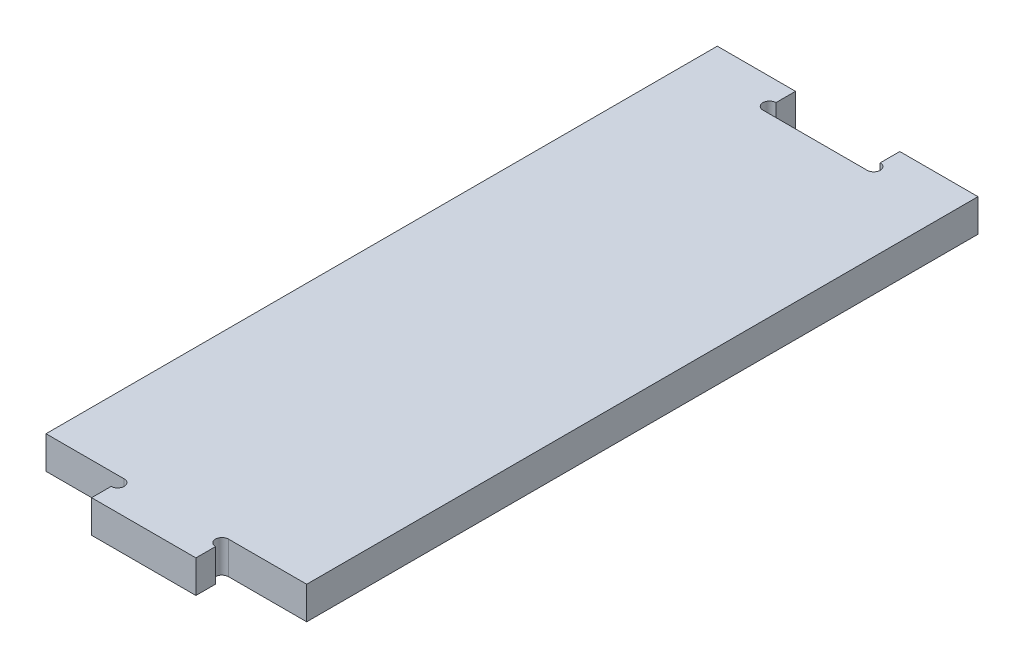
ISO-10303-21;
HEADER;
FILE_DESCRIPTION(('STEP AP214'),'2;1');
FILE_NAME('part.step','',(''),(''),'','','');
FILE_SCHEMA(('AUTOMOTIVE_DESIGN { 1 0 10303 214 1 1 1 1 }'));
ENDSEC;
DATA;
#1=APPLICATION_CONTEXT('core data for automotive mechanical design processes');
#2=APPLICATION_PROTOCOL_DEFINITION('international standard','automotive_design',2000,#1);
#3=PRODUCT_CONTEXT('',#1,'mechanical');
#4=PRODUCT('Part','Part','',(#3));
#5=PRODUCT_RELATED_PRODUCT_CATEGORY('part','',(#4));
#6=PRODUCT_DEFINITION_FORMATION('','',#4);
#7=PRODUCT_DEFINITION_CONTEXT('part definition',#1,'design');
#8=PRODUCT_DEFINITION('design','',#6,#7);
#9=PRODUCT_DEFINITION_SHAPE('','',#8);
#10=(LENGTH_UNIT() NAMED_UNIT(*) SI_UNIT(.MILLI.,.METRE.));
#11=(NAMED_UNIT(*) PLANE_ANGLE_UNIT() SI_UNIT($,.RADIAN.));
#12=(NAMED_UNIT(*) SI_UNIT($,.STERADIAN.) SOLID_ANGLE_UNIT());
#13=UNCERTAINTY_MEASURE_WITH_UNIT(LENGTH_MEASURE(1.E-05),#10,'distance_accuracy_value','');
#14=(GEOMETRIC_REPRESENTATION_CONTEXT(3) GLOBAL_UNCERTAINTY_ASSIGNED_CONTEXT((#13)) GLOBAL_UNIT_ASSIGNED_CONTEXT((#10,
#11,#12)) REPRESENTATION_CONTEXT('',''));
#15=CARTESIAN_POINT('',(0.,0.,0.));
#16=DIRECTION('',(0.,0.,1.));
#17=DIRECTION('',(1.,0.,0.));
#18=AXIS2_PLACEMENT_3D('',#15,#16,#17);
#19=CARTESIAN_POINT('',(0.,5.,0.));
#20=DIRECTION('',(0.,0.,-1.));
#21=DIRECTION('',(-1.,0.,0.));
#22=AXIS2_PLACEMENT_3D('',#19,#20,#21);
#23=PLANE('',#22);
#24=DIRECTION('',(0.,1.,0.));
#25=VECTOR('',#24,1.);
#26=CARTESIAN_POINT('',(28.,0.,0.));
#27=LINE('',#26,#25);
#28=CARTESIAN_POINT('',(28.,0.,0.));
#29=VERTEX_POINT('',#28);
#30=CARTESIAN_POINT('',(28.,5.,0.));
#31=VERTEX_POINT('',#30);
#32=EDGE_CURVE('E246',#29,#31,#27,.T.);
#33=ORIENTED_EDGE('',*,*,#32,.F.);
#34=DIRECTION('',(1.,0.,0.));
#35=VECTOR('',#34,1.);
#36=CARTESIAN_POINT('',(0.,0.,0.));
#37=LINE('',#36,#35);
#38=CARTESIAN_POINT('',(40.,0.,0.));
#39=VERTEX_POINT('',#38);
#40=EDGE_CURVE('E203',#29,#39,#37,.T.);
#41=ORIENTED_EDGE('',*,*,#40,.T.);
#42=DIRECTION('',(0.,-1.,0.));
#43=VECTOR('',#42,1.);
#44=CARTESIAN_POINT('',(40.,5.,0.));
#45=LINE('',#44,#43);
#46=CARTESIAN_POINT('',(40.,5.,0.));
#47=VERTEX_POINT('',#46);
#48=EDGE_CURVE('E224',#47,#39,#45,.T.);
#49=ORIENTED_EDGE('',*,*,#48,.F.);
#50=DIRECTION('',(1.,0.,0.));
#51=VECTOR('',#50,1.);
#52=CARTESIAN_POINT('',(0.,5.,0.));
#53=LINE('',#52,#51);
#54=EDGE_CURVE('E190',#31,#47,#53,.T.);
#55=ORIENTED_EDGE('',*,*,#54,.F.);
#56=EDGE_LOOP('',(#33,#41,#49,#55));
#57=FACE_BOUND('',#56,.T.);
#58=ADVANCED_FACE('F35',(#57),#23,.F.);
#59=CARTESIAN_POINT('',(0.,5.,-103.));
#60=DIRECTION('',(0.,0.,1.));
#61=DIRECTION('',(1.,0.,0.));
#62=AXIS2_PLACEMENT_3D('',#59,#60,#61);
#63=PLANE('',#62);
#64=DIRECTION('',(-1.,0.,0.));
#65=VECTOR('',#64,1.);
#66=CARTESIAN_POINT('',(0.,5.,-103.));
#67=LINE('',#66,#65);
#68=CARTESIAN_POINT('',(12.,5.,-103.));
#69=VERTEX_POINT('',#68);
#70=CARTESIAN_POINT('',(0.,5.,-103.));
#71=VERTEX_POINT('',#70);
#72=EDGE_CURVE('E327',#69,#71,#67,.T.);
#73=ORIENTED_EDGE('',*,*,#72,.F.);
#74=DIRECTION('',(0.,1.,0.));
#75=VECTOR('',#74,1.);
#76=CARTESIAN_POINT('',(12.,0.,-103.));
#77=LINE('',#76,#75);
#78=CARTESIAN_POINT('',(12.,0.,-103.));
#79=VERTEX_POINT('',#78);
#80=EDGE_CURVE('E180',#79,#69,#77,.T.);
#81=ORIENTED_EDGE('',*,*,#80,.F.);
#82=DIRECTION('',(-1.,0.,0.));
#83=VECTOR('',#82,1.);
#84=CARTESIAN_POINT('',(0.,0.,-103.));
#85=LINE('',#84,#83);
#86=CARTESIAN_POINT('',(0.,0.,-103.));
#87=VERTEX_POINT('',#86);
#88=EDGE_CURVE('E214',#79,#87,#85,.T.);
#89=ORIENTED_EDGE('',*,*,#88,.T.);
#90=DIRECTION('',(0.,-1.,0.));
#91=VECTOR('',#90,1.);
#92=CARTESIAN_POINT('',(0.,5.,-103.));
#93=LINE('',#92,#91);
#94=EDGE_CURVE('E217',#71,#87,#93,.T.);
#95=ORIENTED_EDGE('',*,*,#94,.F.);
#96=EDGE_LOOP('',(#73,#81,#89,#95));
#97=FACE_BOUND('',#96,.T.);
#98=ADVANCED_FACE('F333',(#97),#63,.F.);
#99=CARTESIAN_POINT('',(0.,5.,0.));
#100=DIRECTION('',(1.,0.,0.));
#101=DIRECTION('',(0.,0.,-1.));
#102=AXIS2_PLACEMENT_3D('',#99,#100,#101);
#103=PLANE('',#102);
#104=DIRECTION('',(0.,0.,1.));
#105=VECTOR('',#104,1.);
#106=CARTESIAN_POINT('',(0.,0.,0.));
#107=LINE('',#106,#105);
#108=CARTESIAN_POINT('',(0.,0.,0.));
#109=VERTEX_POINT('',#108);
#110=EDGE_CURVE('E182',#87,#109,#107,.T.);
#111=ORIENTED_EDGE('',*,*,#110,.T.);
#112=DIRECTION('',(0.,-1.,0.));
#113=VECTOR('',#112,1.);
#114=CARTESIAN_POINT('',(0.,5.,0.));
#115=LINE('',#114,#113);
#116=CARTESIAN_POINT('',(0.,5.,0.));
#117=VERTEX_POINT('',#116);
#118=EDGE_CURVE('E226',#117,#109,#115,.T.);
#119=ORIENTED_EDGE('',*,*,#118,.F.);
#120=DIRECTION('',(0.,0.,1.));
#121=VECTOR('',#120,1.);
#122=CARTESIAN_POINT('',(0.,5.,0.));
#123=LINE('',#122,#121);
#124=EDGE_CURVE('E187',#71,#117,#123,.T.);
#125=ORIENTED_EDGE('',*,*,#124,.F.);
#126=ORIENTED_EDGE('',*,*,#94,.T.);
#127=EDGE_LOOP('',(#111,#119,#125,#126));
#128=FACE_BOUND('',#127,.T.);
#129=ADVANCED_FACE('F37',(#128),#103,.F.);
#130=CARTESIAN_POINT('',(12.,0.,0.));
#131=VERTEX_POINT('',#130);
#132=EDGE_CURVE('E206',#109,#131,#37,.T.);
#133=ORIENTED_EDGE('',*,*,#132,.T.);
#134=DIRECTION('',(0.,1.,0.));
#135=VECTOR('',#134,1.);
#136=CARTESIAN_POINT('',(12.,0.,0.));
#137=LINE('',#136,#135);
#138=CARTESIAN_POINT('',(12.,5.,0.));
#139=VERTEX_POINT('',#138);
#140=EDGE_CURVE('E176',#131,#139,#137,.T.);
#141=ORIENTED_EDGE('',*,*,#140,.T.);
#142=EDGE_CURVE('E200',#117,#139,#53,.T.);
#143=ORIENTED_EDGE('',*,*,#142,.F.);
#144=ORIENTED_EDGE('',*,*,#118,.T.);
#145=EDGE_LOOP('',(#133,#141,#143,#144));
#146=FACE_BOUND('',#145,.T.);
#147=ADVANCED_FACE('F323',(#146),#23,.F.);
#148=CARTESIAN_POINT('',(40.,5.,0.));
#149=DIRECTION('',(-1.,0.,0.));
#150=DIRECTION('',(0.,0.,1.));
#151=AXIS2_PLACEMENT_3D('',#148,#149,#150);
#152=PLANE('',#151);
#153=DIRECTION('',(0.,0.,-1.));
#154=VECTOR('',#153,1.);
#155=CARTESIAN_POINT('',(40.,0.,0.));
#156=LINE('',#155,#154);
#157=CARTESIAN_POINT('',(40.,0.,-103.));
#158=VERTEX_POINT('',#157);
#159=EDGE_CURVE('E211',#39,#158,#156,.T.);
#160=ORIENTED_EDGE('',*,*,#159,.T.);
#161=DIRECTION('',(0.,-1.,0.));
#162=VECTOR('',#161,1.);
#163=CARTESIAN_POINT('',(40.,5.,-103.));
#164=LINE('',#163,#162);
#165=CARTESIAN_POINT('',(40.,5.,-103.));
#166=VERTEX_POINT('',#165);
#167=EDGE_CURVE('E220',#166,#158,#164,.T.);
#168=ORIENTED_EDGE('',*,*,#167,.F.);
#169=DIRECTION('',(0.,0.,-1.));
#170=VECTOR('',#169,1.);
#171=CARTESIAN_POINT('',(40.,5.,0.));
#172=LINE('',#171,#170);
#173=EDGE_CURVE('E194',#47,#166,#172,.T.);
#174=ORIENTED_EDGE('',*,*,#173,.F.);
#175=ORIENTED_EDGE('',*,*,#48,.T.);
#176=EDGE_LOOP('',(#160,#168,#174,#175));
#177=FACE_BOUND('',#176,.T.);
#178=ADVANCED_FACE('F357',(#177),#152,.F.);
#179=CARTESIAN_POINT('',(28.,0.,-103.));
#180=VERTEX_POINT('',#179);
#181=EDGE_CURVE('E191',#158,#180,#85,.T.);
#182=ORIENTED_EDGE('',*,*,#181,.T.);
#183=DIRECTION('',(0.,1.,0.));
#184=VECTOR('',#183,1.);
#185=CARTESIAN_POINT('',(28.,0.,-103.));
#186=LINE('',#185,#184);
#187=CARTESIAN_POINT('',(28.,5.,-103.));
#188=VERTEX_POINT('',#187);
#189=EDGE_CURVE('E157',#180,#188,#186,.T.);
#190=ORIENTED_EDGE('',*,*,#189,.T.);
#191=EDGE_CURVE('E221',#166,#188,#67,.T.);
#192=ORIENTED_EDGE('',*,*,#191,.F.);
#193=ORIENTED_EDGE('',*,*,#167,.T.);
#194=EDGE_LOOP('',(#182,#190,#192,#193));
#195=FACE_BOUND('',#194,.T.);
#196=ADVANCED_FACE('F354',(#195),#63,.F.);
#197=CARTESIAN_POINT('',(0.,5.,0.));
#198=DIRECTION('',(0.,-1.,0.));
#199=DIRECTION('',(0.,0.,-1.));
#200=AXIS2_PLACEMENT_3D('',#197,#198,#199);
#201=PLANE('',#200);
#202=DIRECTION('',(0.,0.,-1.));
#203=VECTOR('',#202,1.);
#204=CARTESIAN_POINT('',(28.,5.,-103.));
#205=LINE('',#204,#203);
#206=CARTESIAN_POINT('',(28.,5.,-100.));
#207=VERTEX_POINT('',#206);
#208=EDGE_CURVE('E167',#207,#188,#205,.T.);
#209=ORIENTED_EDGE('',*,*,#208,.F.);
#210=CARTESIAN_POINT('',(28.,5.,-99.));
#211=DIRECTION('',(0.,1.,0.));
#212=DIRECTION('',(0.,0.,1.));
#213=AXIS2_PLACEMENT_3D('',#210,#211,#212);
#214=CIRCLE('',#213,1.);
#215=CARTESIAN_POINT('',(28.,5.,-98.));
#216=VERTEX_POINT('',#215);
#217=EDGE_CURVE('E149',#216,#207,#214,.T.);
#218=ORIENTED_EDGE('',*,*,#217,.F.);
#219=DIRECTION('',(1.,0.,0.));
#220=VECTOR('',#219,1.);
#221=CARTESIAN_POINT('',(12.,5.,-98.));
#222=LINE('',#221,#220);
#223=CARTESIAN_POINT('',(12.,5.,-98.));
#224=VERTEX_POINT('',#223);
#225=EDGE_CURVE('E165',#224,#216,#222,.T.);
#226=ORIENTED_EDGE('',*,*,#225,.F.);
#227=CARTESIAN_POINT('',(12.,5.,-99.));
#228=DIRECTION('',(0.,1.,0.));
#229=DIRECTION('',(0.,0.,1.));
#230=AXIS2_PLACEMENT_3D('',#227,#228,#229);
#231=CIRCLE('',#230,1.);
#232=CARTESIAN_POINT('',(12.,5.,-100.));
#233=VERTEX_POINT('',#232);
#234=EDGE_CURVE('E304',#233,#224,#231,.T.);
#235=ORIENTED_EDGE('',*,*,#234,.F.);
#236=DIRECTION('',(0.,0.,1.));
#237=VECTOR('',#236,1.);
#238=CARTESIAN_POINT('',(12.,5.,-103.));
#239=LINE('',#238,#237);
#240=EDGE_CURVE('E171',#69,#233,#239,.T.);
#241=ORIENTED_EDGE('',*,*,#240,.F.);
#242=ORIENTED_EDGE('',*,*,#72,.T.);
#243=ORIENTED_EDGE('',*,*,#124,.T.);
#244=ORIENTED_EDGE('',*,*,#142,.T.);
#245=CARTESIAN_POINT('',(12.,5.,1.));
#246=DIRECTION('',(0.,1.,0.));
#247=DIRECTION('',(0.,0.,1.));
#248=AXIS2_PLACEMENT_3D('',#245,#246,#247);
#249=CIRCLE('',#248,1.);
#250=CARTESIAN_POINT('',(12.,5.,2.));
#251=VERTEX_POINT('',#250);
#252=EDGE_CURVE('E57',#251,#139,#249,.T.);
#253=ORIENTED_EDGE('',*,*,#252,.F.);
#254=DIRECTION('',(0.,0.,1.));
#255=VECTOR('',#254,1.);
#256=CARTESIAN_POINT('',(12.,5.,0.));
#257=LINE('',#256,#255);
#258=CARTESIAN_POINT('',(12.,5.,5.));
#259=VERTEX_POINT('',#258);
#260=EDGE_CURVE('E238',#251,#259,#257,.T.);
#261=ORIENTED_EDGE('',*,*,#260,.T.);
#262=DIRECTION('',(1.,0.,0.));
#263=VECTOR('',#262,1.);
#264=CARTESIAN_POINT('',(12.,5.,5.));
#265=LINE('',#264,#263);
#266=CARTESIAN_POINT('',(28.,5.,5.));
#267=VERTEX_POINT('',#266);
#268=EDGE_CURVE('E239',#259,#267,#265,.T.);
#269=ORIENTED_EDGE('',*,*,#268,.T.);
#270=DIRECTION('',(0.,0.,-1.));
#271=VECTOR('',#270,1.);
#272=CARTESIAN_POINT('',(28.,5.,0.));
#273=LINE('',#272,#271);
#274=CARTESIAN_POINT('',(28.,5.,2.));
#275=VERTEX_POINT('',#274);
#276=EDGE_CURVE('E264',#267,#275,#273,.T.);
#277=ORIENTED_EDGE('',*,*,#276,.T.);
#278=CARTESIAN_POINT('',(28.,5.,1.));
#279=DIRECTION('',(0.,1.,0.));
#280=DIRECTION('',(0.,0.,1.));
#281=AXIS2_PLACEMENT_3D('',#278,#279,#280);
#282=CIRCLE('',#281,1.);
#283=EDGE_CURVE('E50',#31,#275,#282,.T.);
#284=ORIENTED_EDGE('',*,*,#283,.F.);
#285=ORIENTED_EDGE('',*,*,#54,.T.);
#286=ORIENTED_EDGE('',*,*,#173,.T.);
#287=ORIENTED_EDGE('',*,*,#191,.T.);
#288=EDGE_LOOP('',(#209,#218,#226,#235,#241,#242,#243,#244,#253,#261,#269,#277,#284,#285,#286,#287));
#289=FACE_BOUND('',#288,.T.);
#290=ADVANCED_FACE('F163',(#289),#201,.F.);
#291=CARTESIAN_POINT('',(0.,0.,0.));
#292=DIRECTION('',(0.,-1.,0.));
#293=DIRECTION('',(0.,0.,-1.));
#294=AXIS2_PLACEMENT_3D('',#291,#292,#293);
#295=PLANE('',#294);
#296=CARTESIAN_POINT('',(28.,0.,-99.));
#297=DIRECTION('',(0.,-1.,0.));
#298=DIRECTION('',(0.,0.,-1.));
#299=AXIS2_PLACEMENT_3D('',#296,#297,#298);
#300=CIRCLE('',#299,1.);
#301=CARTESIAN_POINT('',(28.,0.,-100.));
#302=VERTEX_POINT('',#301);
#303=CARTESIAN_POINT('',(28.,0.,-98.));
#304=VERTEX_POINT('',#303);
#305=EDGE_CURVE('E152',#302,#304,#300,.T.);
#306=ORIENTED_EDGE('',*,*,#305,.F.);
#307=DIRECTION('',(0.,0.,-1.));
#308=VECTOR('',#307,1.);
#309=CARTESIAN_POINT('',(28.,0.,-103.));
#310=LINE('',#309,#308);
#311=EDGE_CURVE('E186',#302,#180,#310,.T.);
#312=ORIENTED_EDGE('',*,*,#311,.T.);
#313=ORIENTED_EDGE('',*,*,#181,.F.);
#314=ORIENTED_EDGE('',*,*,#159,.F.);
#315=ORIENTED_EDGE('',*,*,#40,.F.);
#316=CARTESIAN_POINT('',(28.,0.,1.));
#317=DIRECTION('',(0.,-1.,0.));
#318=DIRECTION('',(0.,0.,-1.));
#319=AXIS2_PLACEMENT_3D('',#316,#317,#318);
#320=CIRCLE('',#319,1.);
#321=CARTESIAN_POINT('',(28.,0.,2.));
#322=VERTEX_POINT('',#321);
#323=EDGE_CURVE('E240',#322,#29,#320,.T.);
#324=ORIENTED_EDGE('',*,*,#323,.F.);
#325=DIRECTION('',(0.,0.,-1.));
#326=VECTOR('',#325,1.);
#327=CARTESIAN_POINT('',(28.,0.,0.));
#328=LINE('',#327,#326);
#329=CARTESIAN_POINT('',(28.,0.,5.));
#330=VERTEX_POINT('',#329);
#331=EDGE_CURVE('E258',#330,#322,#328,.T.);
#332=ORIENTED_EDGE('',*,*,#331,.F.);
#333=DIRECTION('',(1.,0.,0.));
#334=VECTOR('',#333,1.);
#335=CARTESIAN_POINT('',(12.,0.,5.));
#336=LINE('',#335,#334);
#337=CARTESIAN_POINT('',(12.,0.,5.));
#338=VERTEX_POINT('',#337);
#339=EDGE_CURVE('E262',#338,#330,#336,.T.);
#340=ORIENTED_EDGE('',*,*,#339,.F.);
#341=DIRECTION('',(0.,0.,1.));
#342=VECTOR('',#341,1.);
#343=CARTESIAN_POINT('',(12.,0.,0.));
#344=LINE('',#343,#342);
#345=CARTESIAN_POINT('',(12.,0.,2.));
#346=VERTEX_POINT('',#345);
#347=EDGE_CURVE('E241',#346,#338,#344,.T.);
#348=ORIENTED_EDGE('',*,*,#347,.F.);
#349=CARTESIAN_POINT('',(12.,0.,1.));
#350=DIRECTION('',(0.,-1.,0.));
#351=DIRECTION('',(0.,0.,-1.));
#352=AXIS2_PLACEMENT_3D('',#349,#350,#351);
#353=CIRCLE('',#352,1.);
#354=EDGE_CURVE('E286',#131,#346,#353,.T.);
#355=ORIENTED_EDGE('',*,*,#354,.F.);
#356=ORIENTED_EDGE('',*,*,#132,.F.);
#357=ORIENTED_EDGE('',*,*,#110,.F.);
#358=ORIENTED_EDGE('',*,*,#88,.F.);
#359=DIRECTION('',(0.,0.,1.));
#360=VECTOR('',#359,1.);
#361=CARTESIAN_POINT('',(12.,0.,-103.));
#362=LINE('',#361,#360);
#363=CARTESIAN_POINT('',(12.,0.,-100.));
#364=VERTEX_POINT('',#363);
#365=EDGE_CURVE('E173',#79,#364,#362,.T.);
#366=ORIENTED_EDGE('',*,*,#365,.T.);
#367=CARTESIAN_POINT('',(12.,0.,-99.));
#368=DIRECTION('',(0.,-1.,0.));
#369=DIRECTION('',(0.,0.,-1.));
#370=AXIS2_PLACEMENT_3D('',#367,#368,#369);
#371=CIRCLE('',#370,1.);
#372=CARTESIAN_POINT('',(12.,0.,-98.));
#373=VERTEX_POINT('',#372);
#374=EDGE_CURVE('E302',#373,#364,#371,.T.);
#375=ORIENTED_EDGE('',*,*,#374,.F.);
#376=DIRECTION('',(1.,0.,0.));
#377=VECTOR('',#376,1.);
#378=CARTESIAN_POINT('',(12.,0.,-98.));
#379=LINE('',#378,#377);
#380=EDGE_CURVE('E314',#373,#304,#379,.T.);
#381=ORIENTED_EDGE('',*,*,#380,.T.);
#382=EDGE_LOOP('',(#306,#312,#313,#314,#315,#324,#332,#340,#348,#355,#356,#357,#358,#366,#375,#381));
#383=FACE_BOUND('',#382,.T.);
#384=ADVANCED_FACE('F280',(#383),#295,.T.);
#385=CARTESIAN_POINT('',(12.,0.,-103.));
#386=DIRECTION('',(-1.,0.,0.));
#387=DIRECTION('',(0.,0.,1.));
#388=AXIS2_PLACEMENT_3D('',#385,#386,#387);
#389=PLANE('',#388);
#390=ORIENTED_EDGE('',*,*,#240,.T.);
#391=DIRECTION('',(0.,1.,0.));
#392=VECTOR('',#391,1.);
#393=CARTESIAN_POINT('',(12.,-5.,-100.));
#394=LINE('',#393,#392);
#395=EDGE_CURVE('E297',#233,#364,#394,.F.);
#396=ORIENTED_EDGE('',*,*,#395,.T.);
#397=ORIENTED_EDGE('',*,*,#365,.F.);
#398=ORIENTED_EDGE('',*,*,#80,.T.);
#399=EDGE_LOOP('',(#390,#396,#397,#398));
#400=FACE_BOUND('',#399,.T.);
#401=ADVANCED_FACE('F335',(#400),#389,.F.);
#402=CARTESIAN_POINT('',(28.,0.,-103.));
#403=DIRECTION('',(1.,0.,0.));
#404=DIRECTION('',(0.,0.,-1.));
#405=AXIS2_PLACEMENT_3D('',#402,#403,#404);
#406=PLANE('',#405);
#407=ORIENTED_EDGE('',*,*,#311,.F.);
#408=DIRECTION('',(0.,1.,0.));
#409=VECTOR('',#408,1.);
#410=CARTESIAN_POINT('',(28.,-5.,-100.));
#411=LINE('',#410,#409);
#412=EDGE_CURVE('E306',#302,#207,#411,.T.);
#413=ORIENTED_EDGE('',*,*,#412,.T.);
#414=ORIENTED_EDGE('',*,*,#208,.T.);
#415=ORIENTED_EDGE('',*,*,#189,.F.);
#416=EDGE_LOOP('',(#407,#413,#414,#415));
#417=FACE_BOUND('',#416,.T.);
#418=ADVANCED_FACE('F310',(#417),#406,.F.);
#419=CARTESIAN_POINT('',(12.,0.,-98.));
#420=DIRECTION('',(0.,0.,1.));
#421=DIRECTION('',(1.,0.,0.));
#422=AXIS2_PLACEMENT_3D('',#419,#420,#421);
#423=PLANE('',#422);
#424=ORIENTED_EDGE('',*,*,#225,.T.);
#425=DIRECTION('',(0.,1.,0.));
#426=VECTOR('',#425,1.);
#427=CARTESIAN_POINT('',(28.,0.,-98.));
#428=LINE('',#427,#426);
#429=EDGE_CURVE('E146',#304,#216,#428,.T.);
#430=ORIENTED_EDGE('',*,*,#429,.F.);
#431=ORIENTED_EDGE('',*,*,#380,.F.);
#432=DIRECTION('',(0.,1.,0.));
#433=VECTOR('',#432,1.);
#434=CARTESIAN_POINT('',(12.,0.,-98.));
#435=LINE('',#434,#433);
#436=EDGE_CURVE('E158',#373,#224,#435,.T.);
#437=ORIENTED_EDGE('',*,*,#436,.T.);
#438=EDGE_LOOP('',(#424,#430,#431,#437));
#439=FACE_BOUND('',#438,.T.);
#440=ADVANCED_FACE('F170',(#439),#423,.F.);
#441=CARTESIAN_POINT('',(12.,0.,0.));
#442=DIRECTION('',(-1.,0.,0.));
#443=DIRECTION('',(0.,0.,1.));
#444=AXIS2_PLACEMENT_3D('',#441,#442,#443);
#445=PLANE('',#444);
#446=DIRECTION('',(0.,1.,0.));
#447=VECTOR('',#446,1.);
#448=CARTESIAN_POINT('',(12.,-5.,2.));
#449=LINE('',#448,#447);
#450=EDGE_CURVE('E11',#346,#251,#449,.T.);
#451=ORIENTED_EDGE('',*,*,#450,.F.);
#452=ORIENTED_EDGE('',*,*,#347,.T.);
#453=DIRECTION('',(0.,1.,0.));
#454=VECTOR('',#453,1.);
#455=CARTESIAN_POINT('',(12.,0.,5.));
#456=LINE('',#455,#454);
#457=EDGE_CURVE('E261',#338,#259,#456,.T.);
#458=ORIENTED_EDGE('',*,*,#457,.T.);
#459=ORIENTED_EDGE('',*,*,#260,.F.);
#460=EDGE_LOOP('',(#451,#452,#458,#459));
#461=FACE_BOUND('',#460,.T.);
#462=ADVANCED_FACE('F320',(#461),#445,.T.);
#463=CARTESIAN_POINT('',(28.,0.,0.));
#464=DIRECTION('',(1.,0.,0.));
#465=DIRECTION('',(0.,0.,-1.));
#466=AXIS2_PLACEMENT_3D('',#463,#464,#465);
#467=PLANE('',#466);
#468=DIRECTION('',(0.,1.,0.));
#469=VECTOR('',#468,1.);
#470=CARTESIAN_POINT('',(28.,-5.,2.));
#471=LINE('',#470,#469);
#472=EDGE_CURVE('E43',#275,#322,#471,.F.);
#473=ORIENTED_EDGE('',*,*,#472,.F.);
#474=ORIENTED_EDGE('',*,*,#276,.F.);
#475=DIRECTION('',(0.,1.,0.));
#476=VECTOR('',#475,1.);
#477=CARTESIAN_POINT('',(28.,0.,5.));
#478=LINE('',#477,#476);
#479=EDGE_CURVE('E255',#330,#267,#478,.T.);
#480=ORIENTED_EDGE('',*,*,#479,.F.);
#481=ORIENTED_EDGE('',*,*,#331,.T.);
#482=EDGE_LOOP('',(#473,#474,#480,#481));
#483=FACE_BOUND('',#482,.T.);
#484=ADVANCED_FACE('F278',(#483),#467,.T.);
#485=CARTESIAN_POINT('',(12.,0.,5.));
#486=DIRECTION('',(0.,0.,1.));
#487=DIRECTION('',(1.,0.,0.));
#488=AXIS2_PLACEMENT_3D('',#485,#486,#487);
#489=PLANE('',#488);
#490=ORIENTED_EDGE('',*,*,#268,.F.);
#491=ORIENTED_EDGE('',*,*,#457,.F.);
#492=ORIENTED_EDGE('',*,*,#339,.T.);
#493=ORIENTED_EDGE('',*,*,#479,.T.);
#494=EDGE_LOOP('',(#490,#491,#492,#493));
#495=FACE_BOUND('',#494,.T.);
#496=ADVANCED_FACE('F273',(#495),#489,.T.);
#497=CARTESIAN_POINT('',(28.,-5.,1.));
#498=DIRECTION('',(0.,1.,0.));
#499=DIRECTION('',(0.,0.,1.));
#500=AXIS2_PLACEMENT_3D('',#497,#498,#499);
#501=CYLINDRICAL_SURFACE('',#500,1.);
#502=ORIENTED_EDGE('',*,*,#32,.T.);
#503=ORIENTED_EDGE('',*,*,#283,.T.);
#504=ORIENTED_EDGE('',*,*,#472,.T.);
#505=ORIENTED_EDGE('',*,*,#323,.T.);
#506=EDGE_LOOP('',(#502,#503,#504,#505));
#507=FACE_BOUND('',#506,.T.);
#508=ADVANCED_FACE('F346',(#507),#501,.F.);
#509=CARTESIAN_POINT('',(12.,-5.,1.));
#510=DIRECTION('',(0.,1.,0.));
#511=DIRECTION('',(0.,0.,1.));
#512=AXIS2_PLACEMENT_3D('',#509,#510,#511);
#513=CYLINDRICAL_SURFACE('',#512,1.);
#514=ORIENTED_EDGE('',*,*,#450,.T.);
#515=ORIENTED_EDGE('',*,*,#252,.T.);
#516=ORIENTED_EDGE('',*,*,#140,.F.);
#517=ORIENTED_EDGE('',*,*,#354,.T.);
#518=EDGE_LOOP('',(#514,#515,#516,#517));
#519=FACE_BOUND('',#518,.T.);
#520=ADVANCED_FACE('F339',(#519),#513,.F.);
#521=CARTESIAN_POINT('',(12.,-5.,-99.));
#522=DIRECTION('',(0.,1.,0.));
#523=DIRECTION('',(0.,0.,1.));
#524=AXIS2_PLACEMENT_3D('',#521,#522,#523);
#525=CYLINDRICAL_SURFACE('',#524,1.);
#526=ORIENTED_EDGE('',*,*,#234,.T.);
#527=ORIENTED_EDGE('',*,*,#436,.F.);
#528=ORIENTED_EDGE('',*,*,#374,.T.);
#529=ORIENTED_EDGE('',*,*,#395,.F.);
#530=EDGE_LOOP('',(#526,#527,#528,#529));
#531=FACE_BOUND('',#530,.T.);
#532=ADVANCED_FACE('F337',(#531),#525,.F.);
#533=CARTESIAN_POINT('',(28.,-5.,-99.));
#534=DIRECTION('',(0.,1.,0.));
#535=DIRECTION('',(0.,0.,1.));
#536=AXIS2_PLACEMENT_3D('',#533,#534,#535);
#537=CYLINDRICAL_SURFACE('',#536,1.);
#538=ORIENTED_EDGE('',*,*,#305,.T.);
#539=ORIENTED_EDGE('',*,*,#429,.T.);
#540=ORIENTED_EDGE('',*,*,#217,.T.);
#541=ORIENTED_EDGE('',*,*,#412,.F.);
#542=EDGE_LOOP('',(#538,#539,#540,#541));
#543=FACE_BOUND('',#542,.T.);
#544=ADVANCED_FACE('F148',(#543),#537,.F.);
#545=CLOSED_SHELL('',(#58,#98,#129,#147,#178,#196,#290,#384,#401,#418,#440,#462,#484,#496,#508,
#520,#532,#544));
#546=MANIFOLD_SOLID_BREP('B2',#545);
#547=ADVANCED_BREP_SHAPE_REPRESENTATION('',(#18,#546),#14);
#548=SHAPE_DEFINITION_REPRESENTATION(#9,#547);
ENDSEC;
END-ISO-10303-21;
